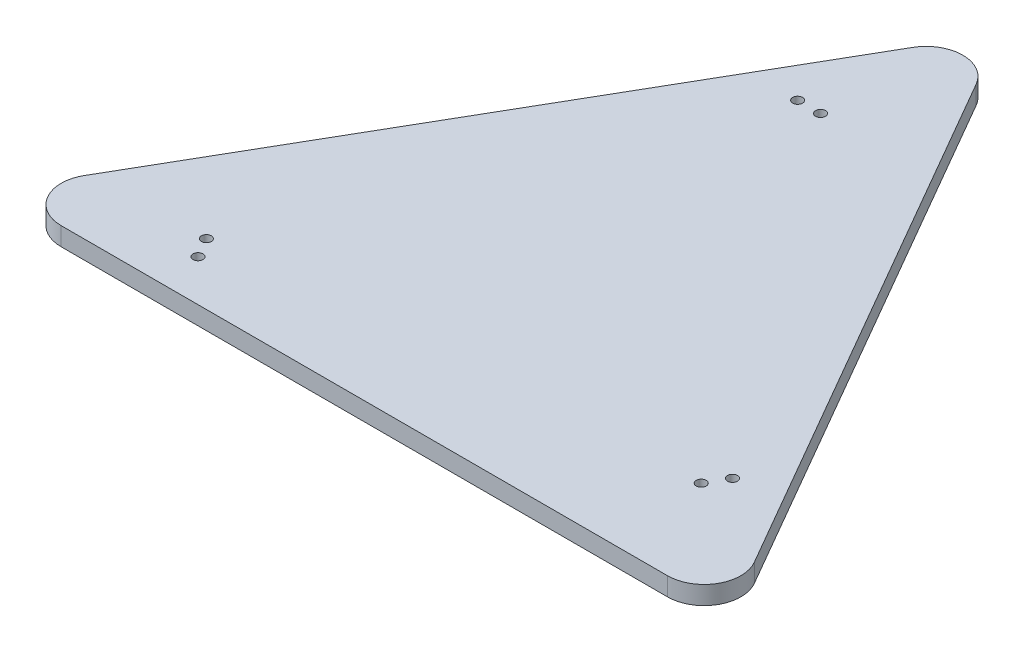
ISO-10303-21;
HEADER;
FILE_DESCRIPTION(('STEP AP214'),'2;1');
FILE_NAME('part.step','',(''),(''),'','','');
FILE_SCHEMA(('AUTOMOTIVE_DESIGN { 1 0 10303 214 1 1 1 1 }'));
ENDSEC;
DATA;
#1=APPLICATION_CONTEXT('core data for automotive mechanical design processes');
#2=APPLICATION_PROTOCOL_DEFINITION('international standard','automotive_design',2000,#1);
#3=PRODUCT_CONTEXT('',#1,'mechanical');
#4=PRODUCT('Part','Part','',(#3));
#5=PRODUCT_RELATED_PRODUCT_CATEGORY('part','',(#4));
#6=PRODUCT_DEFINITION_FORMATION('','',#4);
#7=PRODUCT_DEFINITION_CONTEXT('part definition',#1,'design');
#8=PRODUCT_DEFINITION('design','',#6,#7);
#9=PRODUCT_DEFINITION_SHAPE('','',#8);
#10=(LENGTH_UNIT() NAMED_UNIT(*) SI_UNIT(.MILLI.,.METRE.));
#11=(NAMED_UNIT(*) PLANE_ANGLE_UNIT() SI_UNIT($,.RADIAN.));
#12=(NAMED_UNIT(*) SI_UNIT($,.STERADIAN.) SOLID_ANGLE_UNIT());
#13=UNCERTAINTY_MEASURE_WITH_UNIT(LENGTH_MEASURE(1.E-05),#10,'distance_accuracy_value','');
#14=(GEOMETRIC_REPRESENTATION_CONTEXT(3) GLOBAL_UNCERTAINTY_ASSIGNED_CONTEXT((#13)) GLOBAL_UNIT_ASSIGNED_CONTEXT((#10,
#11,#12)) REPRESENTATION_CONTEXT('',''));
#15=CARTESIAN_POINT('',(0.,0.,0.));
#16=DIRECTION('',(0.,0.,1.));
#17=DIRECTION('',(1.,0.,0.));
#18=AXIS2_PLACEMENT_3D('',#15,#16,#17);
#19=CARTESIAN_POINT('',(127.,6.35,73.3234841870812));
#20=DIRECTION('',(-0.866025403784437,0.,0.500000000000002));
#21=DIRECTION('',(0.500000000000002,0.,0.866025403784437));
#22=AXIS2_PLACEMENT_3D('',#19,#20,#21);
#23=PLANE('',#22);
#24=DIRECTION('',(-0.500000000000002,0.,-0.866025403784437));
#25=VECTOR('',#24,1.);
#26=CARTESIAN_POINT('',(127.,6.35,73.3234841870812));
#27=LINE('',#26,#25);
#28=CARTESIAN_POINT('',(116.001477371938,6.35,54.2734841870813));
#29=VERTEX_POINT('',#28);
#30=CARTESIAN_POINT('',(10.9985226280624,6.35,-127.596968374165));
#31=VERTEX_POINT('',#30);
#32=EDGE_CURVE('E104',#29,#31,#27,.T.);
#33=ORIENTED_EDGE('',*,*,#32,.F.);
#34=DIRECTION('',(0.,-1.,0.));
#35=VECTOR('',#34,1.);
#36=CARTESIAN_POINT('',(116.001477371938,6.35,54.2734841870813));
#37=LINE('',#36,#35);
#38=CARTESIAN_POINT('',(116.001477371938,0.,54.2734841870813));
#39=VERTEX_POINT('',#38);
#40=EDGE_CURVE('E90',#29,#39,#37,.T.);
#41=ORIENTED_EDGE('',*,*,#40,.T.);
#42=DIRECTION('',(-0.500000000000002,0.,-0.866025403784437));
#43=VECTOR('',#42,1.);
#44=CARTESIAN_POINT('',(127.,0.,73.3234841870812));
#45=LINE('',#44,#43);
#46=CARTESIAN_POINT('',(10.9985226280624,0.,-127.596968374165));
#47=VERTEX_POINT('',#46);
#48=EDGE_CURVE('E102',#39,#47,#45,.T.);
#49=ORIENTED_EDGE('',*,*,#48,.T.);
#50=DIRECTION('',(0.,-1.,0.));
#51=VECTOR('',#50,1.);
#52=CARTESIAN_POINT('',(10.9985226280624,6.35,-127.596968374165));
#53=LINE('',#52,#51);
#54=EDGE_CURVE('E106',#47,#31,#53,.F.);
#55=ORIENTED_EDGE('',*,*,#54,.T.);
#56=EDGE_LOOP('',(#33,#41,#49,#55));
#57=FACE_BOUND('',#56,.T.);
#58=ADVANCED_FACE('F33',(#57),#23,.F.);
#59=CARTESIAN_POINT('',(0.,6.35,-146.646968374165));
#60=DIRECTION('',(0.86602540378444,0.,0.499999999999998));
#61=DIRECTION('',(0.499999999999998,0.,-0.86602540378444));
#62=AXIS2_PLACEMENT_3D('',#59,#60,#61);
#63=PLANE('',#62);
#64=DIRECTION('',(-0.499999999999998,0.,0.86602540378444));
#65=VECTOR('',#64,1.);
#66=CARTESIAN_POINT('',(0.,0.,-146.646968374165));
#67=LINE('',#66,#65);
#68=CARTESIAN_POINT('',(-10.9985226280623,0.,-127.596968374165));
#69=VERTEX_POINT('',#68);
#70=CARTESIAN_POINT('',(-116.001477371937,0.,54.2734841870828));
#71=VERTEX_POINT('',#70);
#72=EDGE_CURVE('E110',#69,#71,#67,.T.);
#73=ORIENTED_EDGE('',*,*,#72,.T.);
#74=DIRECTION('',(0.,-1.,0.));
#75=VECTOR('',#74,1.);
#76=CARTESIAN_POINT('',(-116.001477371937,6.35,54.2734841870829));
#77=LINE('',#76,#75);
#78=CARTESIAN_POINT('',(-116.001477371937,6.35,54.2734841870828));
#79=VERTEX_POINT('',#78);
#80=EDGE_CURVE('E11',#71,#79,#77,.F.);
#81=ORIENTED_EDGE('',*,*,#80,.T.);
#82=DIRECTION('',(-0.499999999999998,0.,0.86602540378444));
#83=VECTOR('',#82,1.);
#84=CARTESIAN_POINT('',(0.,6.35,-146.646968374165));
#85=LINE('',#84,#83);
#86=CARTESIAN_POINT('',(-10.9985226280623,6.35,-127.596968374165));
#87=VERTEX_POINT('',#86);
#88=EDGE_CURVE('E136',#87,#79,#85,.T.);
#89=ORIENTED_EDGE('',*,*,#88,.F.);
#90=DIRECTION('',(0.,-1.,0.));
#91=VECTOR('',#90,1.);
#92=CARTESIAN_POINT('',(-10.9985226280623,6.35,-127.596968374165));
#93=LINE('',#92,#91);
#94=EDGE_CURVE('E41',#87,#69,#93,.T.);
#95=ORIENTED_EDGE('',*,*,#94,.T.);
#96=EDGE_LOOP('',(#73,#81,#89,#95));
#97=FACE_BOUND('',#96,.T.);
#98=ADVANCED_FACE('F135',(#97),#63,.F.);
#99=CARTESIAN_POINT('',(-126.999999999999,6.35,73.323484187083));
#100=DIRECTION('',(0.,0.,-1.));
#101=DIRECTION('',(-1.,0.,0.));
#102=AXIS2_PLACEMENT_3D('',#99,#100,#101);
#103=PLANE('',#102);
#104=DIRECTION('',(1.,0.,0.));
#105=VECTOR('',#104,1.);
#106=CARTESIAN_POINT('',(-126.999999999999,0.,73.323484187083));
#107=LINE('',#106,#105);
#108=CARTESIAN_POINT('',(-105.002954743875,0.,73.3234841870828));
#109=VERTEX_POINT('',#108);
#110=CARTESIAN_POINT('',(105.002954743875,0.,73.3234841870813));
#111=VERTEX_POINT('',#110);
#112=EDGE_CURVE('E113',#109,#111,#107,.T.);
#113=ORIENTED_EDGE('',*,*,#112,.T.);
#114=DIRECTION('',(0.,-1.,0.));
#115=VECTOR('',#114,1.);
#116=CARTESIAN_POINT('',(105.002954743875,6.35,73.3234841870813));
#117=LINE('',#116,#115);
#118=CARTESIAN_POINT('',(105.002954743875,6.35,73.3234841870813));
#119=VERTEX_POINT('',#118);
#120=EDGE_CURVE('E91',#111,#119,#117,.F.);
#121=ORIENTED_EDGE('',*,*,#120,.T.);
#122=DIRECTION('',(1.,0.,0.));
#123=VECTOR('',#122,1.);
#124=CARTESIAN_POINT('',(-126.999999999999,6.35,73.323484187083));
#125=LINE('',#124,#123);
#126=CARTESIAN_POINT('',(-105.002954743875,6.35,73.3234841870828));
#127=VERTEX_POINT('',#126);
#128=EDGE_CURVE('E119',#127,#119,#125,.T.);
#129=ORIENTED_EDGE('',*,*,#128,.F.);
#130=DIRECTION('',(0.,-1.,0.));
#131=VECTOR('',#130,1.);
#132=CARTESIAN_POINT('',(-105.002954743875,6.35,73.3234841870828));
#133=LINE('',#132,#131);
#134=EDGE_CURVE('E96',#127,#109,#133,.T.);
#135=ORIENTED_EDGE('',*,*,#134,.T.);
#136=EDGE_LOOP('',(#113,#121,#129,#135));
#137=FACE_BOUND('',#136,.T.);
#138=ADVANCED_FACE('F144',(#137),#103,.F.);
#139=CARTESIAN_POINT('',(0.,6.35,0.));
#140=DIRECTION('',(0.,1.,0.));
#141=DIRECTION('',(0.,0.,1.));
#142=AXIS2_PLACEMENT_3D('',#139,#140,#141);
#143=PLANE('',#142);
#144=CARTESIAN_POINT('',(87.0425218066059,6.35,32.8616929468107));
#145=DIRECTION('',(0.,1.,0.));
#146=DIRECTION('',(0.,0.,1.));
#147=AXIS2_PLACEMENT_3D('',#144,#145,#146);
#148=CIRCLE('',#147,1.72720000000002);
#149=CARTESIAN_POINT('',(87.0425218066059,6.35,34.5888929468107));
#150=VERTEX_POINT('',#149);
#151=EDGE_CURVE('E172',#150,#150,#148,.T.);
#152=ORIENTED_EDGE('',*,*,#151,.F.);
#153=EDGE_LOOP('',(#152));
#154=FACE_BOUND('',#153,.T.);
#155=CARTESIAN_POINT('',(-7.1374,6.35,-91.8118815673871));
#156=DIRECTION('',(0.,1.,0.));
#157=DIRECTION('',(0.,0.,1.));
#158=AXIS2_PLACEMENT_3D('',#155,#156,#157);
#159=CIRCLE('',#158,1.7272);
#160=CARTESIAN_POINT('',(-7.1374,6.35,-90.0846815673871));
#161=VERTEX_POINT('',#160);
#162=EDGE_CURVE('E166',#161,#161,#159,.T.);
#163=ORIENTED_EDGE('',*,*,#162,.F.);
#164=EDGE_LOOP('',(#163));
#165=FACE_BOUND('',#164,.T.);
#166=CARTESIAN_POINT('',(-15.0622,6.35,-91.8118815673871));
#167=DIRECTION('',(0.,1.,0.));
#168=DIRECTION('',(0.,0.,1.));
#169=AXIS2_PLACEMENT_3D('',#166,#167,#168);
#170=CIRCLE('',#169,1.7272);
#171=CARTESIAN_POINT('',(-15.0622,6.35,-90.0846815673871));
#172=VERTEX_POINT('',#171);
#173=EDGE_CURVE('E160',#172,#172,#170,.T.);
#174=ORIENTED_EDGE('',*,*,#173,.F.);
#175=EDGE_LOOP('',(#174));
#176=FACE_BOUND('',#175,.T.);
#177=CARTESIAN_POINT('',(83.0801218066059,6.35,39.7247710667216));
#178=DIRECTION('',(0.,1.,0.));
#179=DIRECTION('',(0.,0.,1.));
#180=AXIS2_PLACEMENT_3D('',#177,#178,#179);
#181=CIRCLE('',#180,1.72720000000002);
#182=CARTESIAN_POINT('',(83.0801218066059,6.35,41.4519710667216));
#183=VERTEX_POINT('',#182);
#184=EDGE_CURVE('E154',#183,#183,#181,.T.);
#185=ORIENTED_EDGE('',*,*,#184,.F.);
#186=EDGE_LOOP('',(#185));
#187=FACE_BOUND('',#186,.T.);
#188=CARTESIAN_POINT('',(-71.9803218066055,6.35,58.9501886205757));
#189=DIRECTION('',(0.,1.,0.));
#190=DIRECTION('',(0.,0.,1.));
#191=AXIS2_PLACEMENT_3D('',#188,#189,#190);
#192=CIRCLE('',#191,1.72720000000002);
#193=CARTESIAN_POINT('',(-71.9803218066055,6.35,60.6773886205757));
#194=VERTEX_POINT('',#193);
#195=EDGE_CURVE('E149',#194,#194,#192,.T.);
#196=ORIENTED_EDGE('',*,*,#195,.F.);
#197=EDGE_LOOP('',(#196));
#198=FACE_BOUND('',#197,.T.);
#199=CARTESIAN_POINT('',(-75.9427218066056,6.35,52.0871105006648));
#200=DIRECTION('',(0.,1.,0.));
#201=DIRECTION('',(0.,0.,1.));
#202=AXIS2_PLACEMENT_3D('',#199,#200,#201);
#203=CIRCLE('',#202,1.72720000000001);
#204=CARTESIAN_POINT('',(-75.9427218066056,6.35,53.8143105006648));
#205=VERTEX_POINT('',#204);
#206=EDGE_CURVE('E116',#205,#205,#203,.T.);
#207=ORIENTED_EDGE('',*,*,#206,.F.);
#208=EDGE_LOOP('',(#207));
#209=FACE_BOUND('',#208,.T.);
#210=ORIENTED_EDGE('',*,*,#128,.T.);
#211=CARTESIAN_POINT('',(105.002954743875,6.35,60.6234841870813));
#212=DIRECTION('',(0.,1.,0.));
#213=DIRECTION('',(0.,0.,1.));
#214=AXIS2_PLACEMENT_3D('',#211,#212,#213);
#215=CIRCLE('',#214,12.7);
#216=EDGE_CURVE('E132',#119,#29,#215,.T.);
#217=ORIENTED_EDGE('',*,*,#216,.T.);
#218=ORIENTED_EDGE('',*,*,#32,.T.);
#219=CARTESIAN_POINT('',(0.,6.35,-121.246968374165));
#220=DIRECTION('',(0.,1.,0.));
#221=DIRECTION('',(0.,0.,1.));
#222=AXIS2_PLACEMENT_3D('',#219,#220,#221);
#223=CIRCLE('',#222,12.7);
#224=EDGE_CURVE('E53',#31,#87,#223,.T.);
#225=ORIENTED_EDGE('',*,*,#224,.T.);
#226=ORIENTED_EDGE('',*,*,#88,.T.);
#227=CARTESIAN_POINT('',(-105.002954743875,6.35,60.6234841870828));
#228=DIRECTION('',(0.,1.,0.));
#229=DIRECTION('',(0.,0.,1.));
#230=AXIS2_PLACEMENT_3D('',#227,#228,#229);
#231=CIRCLE('',#230,12.7);
#232=EDGE_CURVE('E130',#79,#127,#231,.T.);
#233=ORIENTED_EDGE('',*,*,#232,.T.);
#234=EDGE_LOOP('',(#210,#217,#218,#225,#226,#233));
#235=FACE_BOUND('',#234,.T.);
#236=ADVANCED_FACE('F183',(#154,#165,#176,#187,#198,#209,#235),#143,.T.);
#237=CARTESIAN_POINT('',(0.,0.,0.));
#238=DIRECTION('',(0.,1.,0.));
#239=DIRECTION('',(0.,0.,1.));
#240=AXIS2_PLACEMENT_3D('',#237,#238,#239);
#241=PLANE('',#240);
#242=CARTESIAN_POINT('',(87.0425218066059,0.,32.8616929468107));
#243=DIRECTION('',(0.,1.,0.));
#244=DIRECTION('',(0.,0.,1.));
#245=AXIS2_PLACEMENT_3D('',#242,#243,#244);
#246=CIRCLE('',#245,1.72720000000002);
#247=CARTESIAN_POINT('',(87.0425218066059,0.,34.5888929468107));
#248=VERTEX_POINT('',#247);
#249=EDGE_CURVE('E175',#248,#248,#246,.T.);
#250=ORIENTED_EDGE('',*,*,#249,.T.);
#251=EDGE_LOOP('',(#250));
#252=FACE_BOUND('',#251,.T.);
#253=CARTESIAN_POINT('',(-7.1374,0.,-91.8118815673871));
#254=DIRECTION('',(0.,1.,0.));
#255=DIRECTION('',(0.,0.,1.));
#256=AXIS2_PLACEMENT_3D('',#253,#254,#255);
#257=CIRCLE('',#256,1.7272);
#258=CARTESIAN_POINT('',(-7.1374,0.,-90.0846815673871));
#259=VERTEX_POINT('',#258);
#260=EDGE_CURVE('E169',#259,#259,#257,.T.);
#261=ORIENTED_EDGE('',*,*,#260,.T.);
#262=EDGE_LOOP('',(#261));
#263=FACE_BOUND('',#262,.T.);
#264=CARTESIAN_POINT('',(-15.0622,0.,-91.8118815673871));
#265=DIRECTION('',(0.,1.,0.));
#266=DIRECTION('',(0.,0.,1.));
#267=AXIS2_PLACEMENT_3D('',#264,#265,#266);
#268=CIRCLE('',#267,1.7272);
#269=CARTESIAN_POINT('',(-15.0622,0.,-90.0846815673871));
#270=VERTEX_POINT('',#269);
#271=EDGE_CURVE('E163',#270,#270,#268,.T.);
#272=ORIENTED_EDGE('',*,*,#271,.T.);
#273=EDGE_LOOP('',(#272));
#274=FACE_BOUND('',#273,.T.);
#275=CARTESIAN_POINT('',(83.0801218066059,0.,39.7247710667216));
#276=DIRECTION('',(0.,1.,0.));
#277=DIRECTION('',(0.,0.,1.));
#278=AXIS2_PLACEMENT_3D('',#275,#276,#277);
#279=CIRCLE('',#278,1.72720000000002);
#280=CARTESIAN_POINT('',(83.0801218066059,0.,41.4519710667216));
#281=VERTEX_POINT('',#280);
#282=EDGE_CURVE('E157',#281,#281,#279,.T.);
#283=ORIENTED_EDGE('',*,*,#282,.T.);
#284=EDGE_LOOP('',(#283));
#285=FACE_BOUND('',#284,.T.);
#286=CARTESIAN_POINT('',(-71.9803218066055,0.,58.9501886205757));
#287=DIRECTION('',(0.,1.,0.));
#288=DIRECTION('',(0.,0.,1.));
#289=AXIS2_PLACEMENT_3D('',#286,#287,#288);
#290=CIRCLE('',#289,1.72720000000002);
#291=CARTESIAN_POINT('',(-71.9803218066055,0.,60.6773886205757));
#292=VERTEX_POINT('',#291);
#293=EDGE_CURVE('E151',#292,#292,#290,.T.);
#294=ORIENTED_EDGE('',*,*,#293,.T.);
#295=EDGE_LOOP('',(#294));
#296=FACE_BOUND('',#295,.T.);
#297=CARTESIAN_POINT('',(-75.9427218066056,0.,52.0871105006648));
#298=DIRECTION('',(0.,1.,0.));
#299=DIRECTION('',(0.,0.,1.));
#300=AXIS2_PLACEMENT_3D('',#297,#298,#299);
#301=CIRCLE('',#300,1.72720000000001);
#302=CARTESIAN_POINT('',(-75.9427218066056,0.,53.8143105006648));
#303=VERTEX_POINT('',#302);
#304=EDGE_CURVE('E111',#303,#303,#301,.T.);
#305=ORIENTED_EDGE('',*,*,#304,.T.);
#306=EDGE_LOOP('',(#305));
#307=FACE_BOUND('',#306,.T.);
#308=ORIENTED_EDGE('',*,*,#48,.F.);
#309=CARTESIAN_POINT('',(105.002954743875,0.,60.6234841870813));
#310=DIRECTION('',(0.,1.,0.));
#311=DIRECTION('',(0.,0.,1.));
#312=AXIS2_PLACEMENT_3D('',#309,#310,#311);
#313=CIRCLE('',#312,12.7);
#314=EDGE_CURVE('E86',#39,#111,#313,.F.);
#315=ORIENTED_EDGE('',*,*,#314,.T.);
#316=ORIENTED_EDGE('',*,*,#112,.F.);
#317=CARTESIAN_POINT('',(-105.002954743875,0.,60.6234841870828));
#318=DIRECTION('',(0.,1.,0.));
#319=DIRECTION('',(0.,0.,1.));
#320=AXIS2_PLACEMENT_3D('',#317,#318,#319);
#321=CIRCLE('',#320,12.7);
#322=EDGE_CURVE('E97',#109,#71,#321,.F.);
#323=ORIENTED_EDGE('',*,*,#322,.T.);
#324=ORIENTED_EDGE('',*,*,#72,.F.);
#325=CARTESIAN_POINT('',(0.,0.,-121.246968374165));
#326=DIRECTION('',(0.,1.,0.));
#327=DIRECTION('',(0.,0.,1.));
#328=AXIS2_PLACEMENT_3D('',#325,#326,#327);
#329=CIRCLE('',#328,12.7);
#330=EDGE_CURVE('E105',#69,#47,#329,.F.);
#331=ORIENTED_EDGE('',*,*,#330,.T.);
#332=EDGE_LOOP('',(#308,#315,#316,#323,#324,#331));
#333=FACE_BOUND('',#332,.T.);
#334=ADVANCED_FACE('F108',(#252,#263,#274,#285,#296,#307,#333),#241,.F.);
#335=CARTESIAN_POINT('',(-75.9427218066056,0.,52.0871105006648));
#336=DIRECTION('',(0.,1.,0.));
#337=DIRECTION('',(0.,0.,1.));
#338=AXIS2_PLACEMENT_3D('',#335,#336,#337);
#339=CYLINDRICAL_SURFACE('',#338,1.72720000000001);
#340=ORIENTED_EDGE('',*,*,#304,.F.);
#341=EDGE_LOOP('',(#340));
#342=FACE_BOUND('',#341,.T.);
#343=ORIENTED_EDGE('',*,*,#206,.T.);
#344=EDGE_LOOP('',(#343));
#345=FACE_BOUND('',#344,.T.);
#346=ADVANCED_FACE('F197',(#342,#345),#339,.F.);
#347=CARTESIAN_POINT('',(-71.9803218066055,0.,58.9501886205757));
#348=DIRECTION('',(0.,1.,0.));
#349=DIRECTION('',(0.,0.,1.));
#350=AXIS2_PLACEMENT_3D('',#347,#348,#349);
#351=CYLINDRICAL_SURFACE('',#350,1.72720000000002);
#352=ORIENTED_EDGE('',*,*,#293,.F.);
#353=EDGE_LOOP('',(#352));
#354=FACE_BOUND('',#353,.T.);
#355=ORIENTED_EDGE('',*,*,#195,.T.);
#356=EDGE_LOOP('',(#355));
#357=FACE_BOUND('',#356,.T.);
#358=ADVANCED_FACE('F199',(#354,#357),#351,.F.);
#359=CARTESIAN_POINT('',(83.0801218066059,0.,39.7247710667216));
#360=DIRECTION('',(0.,1.,0.));
#361=DIRECTION('',(0.,0.,1.));
#362=AXIS2_PLACEMENT_3D('',#359,#360,#361);
#363=CYLINDRICAL_SURFACE('',#362,1.72720000000002);
#364=ORIENTED_EDGE('',*,*,#282,.F.);
#365=EDGE_LOOP('',(#364));
#366=FACE_BOUND('',#365,.T.);
#367=ORIENTED_EDGE('',*,*,#184,.T.);
#368=EDGE_LOOP('',(#367));
#369=FACE_BOUND('',#368,.T.);
#370=ADVANCED_FACE('F206',(#366,#369),#363,.F.);
#371=CARTESIAN_POINT('',(-15.0622,0.,-91.8118815673871));
#372=DIRECTION('',(0.,1.,0.));
#373=DIRECTION('',(0.,0.,1.));
#374=AXIS2_PLACEMENT_3D('',#371,#372,#373);
#375=CYLINDRICAL_SURFACE('',#374,1.7272);
#376=ORIENTED_EDGE('',*,*,#271,.F.);
#377=EDGE_LOOP('',(#376));
#378=FACE_BOUND('',#377,.T.);
#379=ORIENTED_EDGE('',*,*,#173,.T.);
#380=EDGE_LOOP('',(#379));
#381=FACE_BOUND('',#380,.T.);
#382=ADVANCED_FACE('F288',(#378,#381),#375,.F.);
#383=CARTESIAN_POINT('',(-7.1374,0.,-91.8118815673871));
#384=DIRECTION('',(0.,1.,0.));
#385=DIRECTION('',(0.,0.,1.));
#386=AXIS2_PLACEMENT_3D('',#383,#384,#385);
#387=CYLINDRICAL_SURFACE('',#386,1.7272);
#388=ORIENTED_EDGE('',*,*,#260,.F.);
#389=EDGE_LOOP('',(#388));
#390=FACE_BOUND('',#389,.T.);
#391=ORIENTED_EDGE('',*,*,#162,.T.);
#392=EDGE_LOOP('',(#391));
#393=FACE_BOUND('',#392,.T.);
#394=ADVANCED_FACE('F297',(#390,#393),#387,.F.);
#395=CARTESIAN_POINT('',(87.0425218066059,0.,32.8616929468107));
#396=DIRECTION('',(0.,1.,0.));
#397=DIRECTION('',(0.,0.,1.));
#398=AXIS2_PLACEMENT_3D('',#395,#396,#397);
#399=CYLINDRICAL_SURFACE('',#398,1.72720000000002);
#400=ORIENTED_EDGE('',*,*,#249,.F.);
#401=EDGE_LOOP('',(#400));
#402=FACE_BOUND('',#401,.T.);
#403=ORIENTED_EDGE('',*,*,#151,.T.);
#404=EDGE_LOOP('',(#403));
#405=FACE_BOUND('',#404,.T.);
#406=ADVANCED_FACE('F181',(#402,#405),#399,.F.);
#407=CARTESIAN_POINT('',(105.002954743875,6.35,60.6234841870813));
#408=DIRECTION('',(0.,-1.,0.));
#409=DIRECTION('',(0.,0.,-1.));
#410=AXIS2_PLACEMENT_3D('',#407,#408,#409);
#411=CYLINDRICAL_SURFACE('',#410,12.7);
#412=ORIENTED_EDGE('',*,*,#216,.F.);
#413=ORIENTED_EDGE('',*,*,#120,.F.);
#414=ORIENTED_EDGE('',*,*,#314,.F.);
#415=ORIENTED_EDGE('',*,*,#40,.F.);
#416=EDGE_LOOP('',(#412,#413,#414,#415));
#417=FACE_BOUND('',#416,.T.);
#418=ADVANCED_FACE('F89',(#417),#411,.T.);
#419=CARTESIAN_POINT('',(-105.002954743875,6.35,60.6234841870828));
#420=DIRECTION('',(0.,-1.,0.));
#421=DIRECTION('',(0.,0.,-1.));
#422=AXIS2_PLACEMENT_3D('',#419,#420,#421);
#423=CYLINDRICAL_SURFACE('',#422,12.7);
#424=ORIENTED_EDGE('',*,*,#232,.F.);
#425=ORIENTED_EDGE('',*,*,#80,.F.);
#426=ORIENTED_EDGE('',*,*,#322,.F.);
#427=ORIENTED_EDGE('',*,*,#134,.F.);
#428=EDGE_LOOP('',(#424,#425,#426,#427));
#429=FACE_BOUND('',#428,.T.);
#430=ADVANCED_FACE('F141',(#429),#423,.T.);
#431=CARTESIAN_POINT('',(0.,6.35,-121.246968374165));
#432=DIRECTION('',(0.,-1.,0.));
#433=DIRECTION('',(0.,0.,-1.));
#434=AXIS2_PLACEMENT_3D('',#431,#432,#433);
#435=CYLINDRICAL_SURFACE('',#434,12.7);
#436=ORIENTED_EDGE('',*,*,#224,.F.);
#437=ORIENTED_EDGE('',*,*,#54,.F.);
#438=ORIENTED_EDGE('',*,*,#330,.F.);
#439=ORIENTED_EDGE('',*,*,#94,.F.);
#440=EDGE_LOOP('',(#436,#437,#438,#439));
#441=FACE_BOUND('',#440,.T.);
#442=ADVANCED_FACE('F35',(#441),#435,.T.);
#443=CLOSED_SHELL('',(#58,#98,#138,#236,#334,#346,#358,#370,#382,#394,#406,#418,#430,#442));
#444=MANIFOLD_SOLID_BREP('B2',#443);
#445=ADVANCED_BREP_SHAPE_REPRESENTATION('',(#18,#444),#14);
#446=SHAPE_DEFINITION_REPRESENTATION(#9,#445);
ENDSEC;
END-ISO-10303-21;
